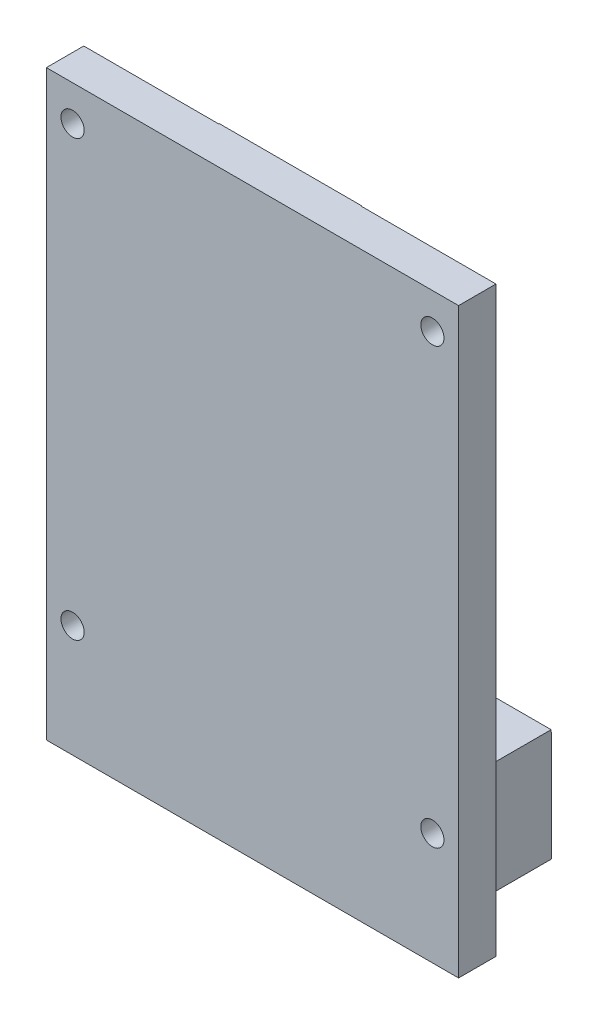
ISO-10303-21;
HEADER;
FILE_DESCRIPTION(('STEP AP214'),'2;1');
FILE_NAME('part.step','',(''),(''),'','','');
FILE_SCHEMA(('AUTOMOTIVE_DESIGN { 1 0 10303 214 1 1 1 1 }'));
ENDSEC;
DATA;
#1=APPLICATION_CONTEXT('core data for automotive mechanical design processes');
#2=APPLICATION_PROTOCOL_DEFINITION('international standard','automotive_design',2000,#1);
#3=PRODUCT_CONTEXT('',#1,'mechanical');
#4=PRODUCT('Part','Part','',(#3));
#5=PRODUCT_RELATED_PRODUCT_CATEGORY('part','',(#4));
#6=PRODUCT_DEFINITION_FORMATION('','',#4);
#7=PRODUCT_DEFINITION_CONTEXT('part definition',#1,'design');
#8=PRODUCT_DEFINITION('design','',#6,#7);
#9=PRODUCT_DEFINITION_SHAPE('','',#8);
#10=(LENGTH_UNIT() NAMED_UNIT(*) SI_UNIT(.MILLI.,.METRE.));
#11=(NAMED_UNIT(*) PLANE_ANGLE_UNIT() SI_UNIT($,.RADIAN.));
#12=(NAMED_UNIT(*) SI_UNIT($,.STERADIAN.) SOLID_ANGLE_UNIT());
#13=UNCERTAINTY_MEASURE_WITH_UNIT(LENGTH_MEASURE(1.E-05),#10,'distance_accuracy_value','');
#14=(GEOMETRIC_REPRESENTATION_CONTEXT(3) GLOBAL_UNCERTAINTY_ASSIGNED_CONTEXT((#13)) GLOBAL_UNIT_ASSIGNED_CONTEXT((#10,
#11,#12)) REPRESENTATION_CONTEXT('',''));
#15=CARTESIAN_POINT('',(0.,0.,0.));
#16=DIRECTION('',(0.,0.,1.));
#17=DIRECTION('',(1.,0.,0.));
#18=AXIS2_PLACEMENT_3D('',#15,#16,#17);
#19=CARTESIAN_POINT('',(0.,0.,0.));
#20=DIRECTION('',(0.,0.,1.));
#21=DIRECTION('',(1.,0.,0.));
#22=AXIS2_PLACEMENT_3D('',#19,#20,#21);
#23=PLANE('',#22);
#24=CARTESIAN_POINT('',(-24.05,23.1,0.));
#25=DIRECTION('',(0.,0.,1.));
#26=DIRECTION('',(1.,0.,0.));
#27=AXIS2_PLACEMENT_3D('',#24,#25,#26);
#28=CIRCLE('',#27,1.55);
#29=CARTESIAN_POINT('',(-22.5,23.1,0.));
#30=VERTEX_POINT('',#29);
#31=EDGE_CURVE('E229',#30,#30,#28,.T.);
#32=ORIENTED_EDGE('',*,*,#31,.T.);
#33=EDGE_LOOP('',(#32));
#34=FACE_BOUND('',#33,.T.);
#35=CARTESIAN_POINT('',(-24.05,-35.,0.));
#36=DIRECTION('',(0.,0.,1.));
#37=DIRECTION('',(1.,0.,0.));
#38=AXIS2_PLACEMENT_3D('',#35,#36,#37);
#39=CIRCLE('',#38,1.55);
#40=CARTESIAN_POINT('',(-22.5,-35.,0.));
#41=VERTEX_POINT('',#40);
#42=EDGE_CURVE('E226',#41,#41,#39,.T.);
#43=ORIENTED_EDGE('',*,*,#42,.T.);
#44=EDGE_LOOP('',(#43));
#45=FACE_BOUND('',#44,.T.);
#46=DIRECTION('',(1.,0.,0.));
#47=VECTOR('',#46,1.);
#48=CARTESIAN_POINT('',(-32.5,-50.,0.));
#49=LINE('',#48,#47);
#50=CARTESIAN_POINT('',(-27.55,-50.,0.));
#51=VERTEX_POINT('',#50);
#52=CARTESIAN_POINT('',(-19.99,-50.,0.));
#53=VERTEX_POINT('',#52);
#54=EDGE_CURVE('E164',#51,#53,#49,.T.);
#55=ORIENTED_EDGE('',*,*,#54,.F.);
#56=DIRECTION('',(0.,-1.,0.));
#57=VECTOR('',#56,1.);
#58=CARTESIAN_POINT('',(-27.55,31.5345007842526,0.));
#59=LINE('',#58,#57);
#60=CARTESIAN_POINT('',(-27.55,27.8391998848108,0.));
#61=VERTEX_POINT('',#60);
#62=EDGE_CURVE('E152',#61,#51,#59,.T.);
#63=ORIENTED_EDGE('',*,*,#62,.F.);
#64=DIRECTION('',(1.,0.,0.));
#65=VECTOR('',#64,1.);
#66=CARTESIAN_POINT('',(0.,27.8391998848108,0.));
#67=LINE('',#66,#65);
#68=CARTESIAN_POINT('',(-9.50000000000001,27.8391998848108,0.));
#69=VERTEX_POINT('',#68);
#70=EDGE_CURVE('E161',#61,#69,#67,.T.);
#71=ORIENTED_EDGE('',*,*,#70,.T.);
#72=DIRECTION('',(0.,-1.,0.));
#73=VECTOR('',#72,1.);
#74=CARTESIAN_POINT('',(-9.50000000000001,-35.,0.));
#75=LINE('',#74,#73);
#76=CARTESIAN_POINT('',(-9.50000000000004,-35.,0.));
#77=VERTEX_POINT('',#76);
#78=EDGE_CURVE('E201',#69,#77,#75,.T.);
#79=ORIENTED_EDGE('',*,*,#78,.T.);
#80=DIRECTION('',(1.,0.,0.));
#81=VECTOR('',#80,1.);
#82=CARTESIAN_POINT('',(32.5,-35.,0.));
#83=LINE('',#82,#81);
#84=CARTESIAN_POINT('',(-19.99,-35.,0.));
#85=VERTEX_POINT('',#84);
#86=EDGE_CURVE('E252',#85,#77,#83,.T.);
#87=ORIENTED_EDGE('',*,*,#86,.F.);
#88=DIRECTION('',(0.,1.,0.));
#89=VECTOR('',#88,1.);
#90=CARTESIAN_POINT('',(-19.99,-50.,0.));
#91=LINE('',#90,#89);
#92=EDGE_CURVE('E171',#53,#85,#91,.T.);
#93=ORIENTED_EDGE('',*,*,#92,.F.);
#94=EDGE_LOOP('',(#55,#63,#71,#79,#87,#93));
#95=FACE_BOUND('',#94,.T.);
#96=ADVANCED_FACE('F49',(#34,#45,#95),#23,.F.);
#97=CARTESIAN_POINT('',(32.5,-35.,-15.));
#98=DIRECTION('',(0.,-1.,0.));
#99=DIRECTION('',(0.,0.,-1.));
#100=AXIS2_PLACEMENT_3D('',#97,#98,#99);
#101=PLANE('',#100);
#102=CARTESIAN_POINT('',(14.99,-35.,-10.));
#103=DIRECTION('',(0.,1.,0.));
#104=DIRECTION('',(0.,0.,1.));
#105=AXIS2_PLACEMENT_3D('',#102,#103,#104);
#106=CIRCLE('',#105,1.675);
#107=CARTESIAN_POINT('',(14.99,-35.,-8.325));
#108=VERTEX_POINT('',#107);
#109=EDGE_CURVE('E243',#108,#108,#106,.T.);
#110=ORIENTED_EDGE('',*,*,#109,.F.);
#111=EDGE_LOOP('',(#110));
#112=FACE_BOUND('',#111,.T.);
#113=DIRECTION('',(0.,0.,1.));
#114=VECTOR('',#113,1.);
#115=CARTESIAN_POINT('',(19.99,-35.,0.));
#116=LINE('',#115,#114);
#117=CARTESIAN_POINT('',(19.99,-35.,-14.9311663726117));
#118=VERTEX_POINT('',#117);
#119=CARTESIAN_POINT('',(19.99,-35.,0.));
#120=VERTEX_POINT('',#119);
#121=EDGE_CURVE('E184',#118,#120,#116,.T.);
#122=ORIENTED_EDGE('',*,*,#121,.F.);
#123=DIRECTION('',(1.,0.,0.));
#124=VECTOR('',#123,1.);
#125=CARTESIAN_POINT('',(19.99,-35.,-14.9311663726117));
#126=LINE('',#125,#124);
#127=CARTESIAN_POINT('',(9.5,-35.,-14.9311663726117));
#128=VERTEX_POINT('',#127);
#129=EDGE_CURVE('E279',#118,#128,#126,.F.);
#130=ORIENTED_EDGE('',*,*,#129,.T.);
#131=DIRECTION('',(0.,0.,-1.));
#132=VECTOR('',#131,1.);
#133=CARTESIAN_POINT('',(9.5,-35.,-15.));
#134=LINE('',#133,#132);
#135=CARTESIAN_POINT('',(9.5,-35.,0.));
#136=VERTEX_POINT('',#135);
#137=EDGE_CURVE('E198',#136,#128,#134,.T.);
#138=ORIENTED_EDGE('',*,*,#137,.F.);
#139=EDGE_CURVE('E239',#136,#120,#83,.T.);
#140=ORIENTED_EDGE('',*,*,#139,.T.);
#141=EDGE_LOOP('',(#122,#130,#138,#140));
#142=FACE_BOUND('',#141,.T.);
#143=ADVANCED_FACE('F353',(#112,#142),#101,.F.);
#144=CARTESIAN_POINT('',(9.49999999999999,27.8391998848108,0.));
#145=VERTEX_POINT('',#144);
#146=CARTESIAN_POINT('',(27.55,27.8391998848108,0.));
#147=VERTEX_POINT('',#146);
#148=EDGE_CURVE('E172',#145,#147,#67,.T.);
#149=ORIENTED_EDGE('',*,*,#148,.T.);
#150=DIRECTION('',(0.,1.,0.));
#151=VECTOR('',#150,1.);
#152=CARTESIAN_POINT('',(27.55,32.7963880239999,0.));
#153=LINE('',#152,#151);
#154=CARTESIAN_POINT('',(27.55,-50.,0.));
#155=VERTEX_POINT('',#154);
#156=EDGE_CURVE('E68',#155,#147,#153,.T.);
#157=ORIENTED_EDGE('',*,*,#156,.F.);
#158=DIRECTION('',(1.,0.,0.));
#159=VECTOR('',#158,1.);
#160=CARTESIAN_POINT('',(32.5,-50.,0.));
#161=LINE('',#160,#159);
#162=CARTESIAN_POINT('',(19.99,-50.,0.));
#163=VERTEX_POINT('',#162);
#164=EDGE_CURVE('E183',#163,#155,#161,.T.);
#165=ORIENTED_EDGE('',*,*,#164,.F.);
#166=DIRECTION('',(0.,1.,0.));
#167=VECTOR('',#166,1.);
#168=CARTESIAN_POINT('',(19.99,-50.,0.));
#169=LINE('',#168,#167);
#170=EDGE_CURVE('E187',#163,#120,#169,.T.);
#171=ORIENTED_EDGE('',*,*,#170,.T.);
#172=ORIENTED_EDGE('',*,*,#139,.F.);
#173=DIRECTION('',(0.,-1.,0.));
#174=VECTOR('',#173,1.);
#175=CARTESIAN_POINT('',(9.5,-35.,0.));
#176=LINE('',#175,#174);
#177=EDGE_CURVE('E202',#145,#136,#176,.T.);
#178=ORIENTED_EDGE('',*,*,#177,.F.);
#179=EDGE_LOOP('',(#149,#157,#165,#171,#172,#178));
#180=FACE_BOUND('',#179,.T.);
#181=CARTESIAN_POINT('',(24.05,-35.,0.));
#182=DIRECTION('',(0.,0.,1.));
#183=DIRECTION('',(1.,0.,0.));
#184=AXIS2_PLACEMENT_3D('',#181,#182,#183);
#185=CIRCLE('',#184,1.55);
#186=CARTESIAN_POINT('',(25.6,-35.,0.));
#187=VERTEX_POINT('',#186);
#188=EDGE_CURVE('E223',#187,#187,#185,.T.);
#189=ORIENTED_EDGE('',*,*,#188,.T.);
#190=EDGE_LOOP('',(#189));
#191=FACE_BOUND('',#190,.T.);
#192=CARTESIAN_POINT('',(24.05,23.1,0.));
#193=DIRECTION('',(0.,0.,1.));
#194=DIRECTION('',(1.,0.,0.));
#195=AXIS2_PLACEMENT_3D('',#192,#193,#194);
#196=CIRCLE('',#195,1.55);
#197=CARTESIAN_POINT('',(25.6,23.1,0.));
#198=VERTEX_POINT('',#197);
#199=EDGE_CURVE('E232',#198,#198,#196,.T.);
#200=ORIENTED_EDGE('',*,*,#199,.T.);
#201=EDGE_LOOP('',(#200));
#202=FACE_BOUND('',#201,.T.);
#203=ADVANCED_FACE('F358',(#180,#191,#202),#23,.F.);
#204=CARTESIAN_POINT('',(-32.5,-50.,5.));
#205=DIRECTION('',(0.,1.,0.));
#206=DIRECTION('',(0.,0.,1.));
#207=AXIS2_PLACEMENT_3D('',#204,#205,#206);
#208=PLANE('',#207);
#209=CARTESIAN_POINT('',(-14.99,-50.,-10.));
#210=DIRECTION('',(0.,1.,0.));
#211=DIRECTION('',(0.,0.,1.));
#212=AXIS2_PLACEMENT_3D('',#209,#210,#211);
#213=CIRCLE('',#212,1.675);
#214=CARTESIAN_POINT('',(-14.99,-50.,-8.325));
#215=VERTEX_POINT('',#214);
#216=EDGE_CURVE('E236',#215,#215,#213,.T.);
#217=ORIENTED_EDGE('',*,*,#216,.T.);
#218=EDGE_LOOP('',(#217));
#219=FACE_BOUND('',#218,.T.);
#220=CARTESIAN_POINT('',(14.99,-50.,-10.));
#221=DIRECTION('',(0.,1.,0.));
#222=DIRECTION('',(0.,0.,1.));
#223=AXIS2_PLACEMENT_3D('',#220,#221,#222);
#224=CIRCLE('',#223,1.675);
#225=CARTESIAN_POINT('',(14.99,-50.,-8.325));
#226=VERTEX_POINT('',#225);
#227=EDGE_CURVE('E235',#226,#226,#224,.T.);
#228=ORIENTED_EDGE('',*,*,#227,.T.);
#229=EDGE_LOOP('',(#228));
#230=FACE_BOUND('',#229,.T.);
#231=ORIENTED_EDGE('',*,*,#164,.T.);
#232=DIRECTION('',(0.,0.,1.));
#233=VECTOR('',#232,1.);
#234=CARTESIAN_POINT('',(27.55,-50.,5.));
#235=LINE('',#234,#233);
#236=CARTESIAN_POINT('',(27.55,-50.,5.));
#237=VERTEX_POINT('',#236);
#238=EDGE_CURVE('E416',#155,#237,#235,.T.);
#239=ORIENTED_EDGE('',*,*,#238,.T.);
#240=DIRECTION('',(1.,0.,0.));
#241=VECTOR('',#240,1.);
#242=CARTESIAN_POINT('',(-32.5,-50.,5.));
#243=LINE('',#242,#241);
#244=CARTESIAN_POINT('',(-27.55,-50.,5.));
#245=VERTEX_POINT('',#244);
#246=EDGE_CURVE('E251',#245,#237,#243,.T.);
#247=ORIENTED_EDGE('',*,*,#246,.F.);
#248=DIRECTION('',(0.,0.,-1.));
#249=VECTOR('',#248,1.);
#250=CARTESIAN_POINT('',(-27.55,-50.,5.));
#251=LINE('',#250,#249);
#252=EDGE_CURVE('E420',#245,#51,#251,.T.);
#253=ORIENTED_EDGE('',*,*,#252,.T.);
#254=ORIENTED_EDGE('',*,*,#54,.T.);
#255=DIRECTION('',(0.,0.,-1.));
#256=VECTOR('',#255,1.);
#257=CARTESIAN_POINT('',(-19.99,-50.,0.));
#258=LINE('',#257,#256);
#259=CARTESIAN_POINT('',(-19.99,-50.,-15.));
#260=VERTEX_POINT('',#259);
#261=EDGE_CURVE('E174',#53,#260,#258,.T.);
#262=ORIENTED_EDGE('',*,*,#261,.T.);
#263=DIRECTION('',(-1.,0.,0.));
#264=VECTOR('',#263,1.);
#265=CARTESIAN_POINT('',(32.5,-50.,-15.));
#266=LINE('',#265,#264);
#267=CARTESIAN_POINT('',(19.99,-50.,-15.));
#268=VERTEX_POINT('',#267);
#269=EDGE_CURVE('E248',#268,#260,#266,.T.);
#270=ORIENTED_EDGE('',*,*,#269,.F.);
#271=DIRECTION('',(0.,0.,1.));
#272=VECTOR('',#271,1.);
#273=CARTESIAN_POINT('',(19.99,-50.,0.));
#274=LINE('',#273,#272);
#275=EDGE_CURVE('E180',#268,#163,#274,.T.);
#276=ORIENTED_EDGE('',*,*,#275,.T.);
#277=EDGE_LOOP('',(#231,#239,#247,#253,#254,#262,#270,#276));
#278=FACE_BOUND('',#277,.T.);
#279=ADVANCED_FACE('F356',(#219,#230,#278),#208,.F.);
#280=CARTESIAN_POINT('',(0.,0.,5.));
#281=DIRECTION('',(0.,0.,1.));
#282=DIRECTION('',(1.,0.,0.));
#283=AXIS2_PLACEMENT_3D('',#280,#281,#282);
#284=PLANE('',#283);
#285=DIRECTION('',(0.,-1.,0.));
#286=VECTOR('',#285,1.);
#287=CARTESIAN_POINT('',(27.55,0.,5.));
#288=LINE('',#287,#286);
#289=CARTESIAN_POINT('',(27.55,27.8391998848108,5.));
#290=VERTEX_POINT('',#289);
#291=EDGE_CURVE('E424',#290,#237,#288,.T.);
#292=ORIENTED_EDGE('',*,*,#291,.F.);
#293=DIRECTION('',(1.,0.,0.));
#294=VECTOR('',#293,1.);
#295=CARTESIAN_POINT('',(-32.5,27.8391998848108,5.));
#296=LINE('',#295,#294);
#297=CARTESIAN_POINT('',(-27.55,27.8391998848108,5.));
#298=VERTEX_POINT('',#297);
#299=EDGE_CURVE('E427',#298,#290,#296,.T.);
#300=ORIENTED_EDGE('',*,*,#299,.F.);
#301=DIRECTION('',(0.,1.,0.));
#302=VECTOR('',#301,1.);
#303=CARTESIAN_POINT('',(-27.55,0.,5.));
#304=LINE('',#303,#302);
#305=EDGE_CURVE('E75',#245,#298,#304,.T.);
#306=ORIENTED_EDGE('',*,*,#305,.F.);
#307=ORIENTED_EDGE('',*,*,#246,.T.);
#308=EDGE_LOOP('',(#292,#300,#306,#307));
#309=FACE_BOUND('',#308,.T.);
#310=CARTESIAN_POINT('',(24.05,23.1,5.));
#311=DIRECTION('',(0.,0.,1.));
#312=DIRECTION('',(1.,0.,0.));
#313=AXIS2_PLACEMENT_3D('',#310,#311,#312);
#314=CIRCLE('',#313,1.55);
#315=CARTESIAN_POINT('',(25.6,23.1,5.));
#316=VERTEX_POINT('',#315);
#317=EDGE_CURVE('E215',#316,#316,#314,.T.);
#318=ORIENTED_EDGE('',*,*,#317,.F.);
#319=EDGE_LOOP('',(#318));
#320=FACE_BOUND('',#319,.T.);
#321=CARTESIAN_POINT('',(-24.05,-35.,5.));
#322=DIRECTION('',(0.,0.,1.));
#323=DIRECTION('',(1.,0.,0.));
#324=AXIS2_PLACEMENT_3D('',#321,#322,#323);
#325=CIRCLE('',#324,1.55);
#326=CARTESIAN_POINT('',(-22.5,-35.,5.));
#327=VERTEX_POINT('',#326);
#328=EDGE_CURVE('E214',#327,#327,#325,.T.);
#329=ORIENTED_EDGE('',*,*,#328,.F.);
#330=EDGE_LOOP('',(#329));
#331=FACE_BOUND('',#330,.T.);
#332=CARTESIAN_POINT('',(24.05,-35.,5.));
#333=DIRECTION('',(0.,0.,1.));
#334=DIRECTION('',(1.,0.,0.));
#335=AXIS2_PLACEMENT_3D('',#332,#333,#334);
#336=CIRCLE('',#335,1.55);
#337=CARTESIAN_POINT('',(25.6,-35.,5.));
#338=VERTEX_POINT('',#337);
#339=EDGE_CURVE('E209',#338,#338,#336,.T.);
#340=ORIENTED_EDGE('',*,*,#339,.F.);
#341=EDGE_LOOP('',(#340));
#342=FACE_BOUND('',#341,.T.);
#343=CARTESIAN_POINT('',(-24.05,23.1,5.));
#344=DIRECTION('',(0.,0.,1.));
#345=DIRECTION('',(1.,0.,0.));
#346=AXIS2_PLACEMENT_3D('',#343,#344,#345);
#347=CIRCLE('',#346,1.55);
#348=CARTESIAN_POINT('',(-22.5,23.1,5.));
#349=VERTEX_POINT('',#348);
#350=EDGE_CURVE('E218',#349,#349,#347,.T.);
#351=ORIENTED_EDGE('',*,*,#350,.F.);
#352=EDGE_LOOP('',(#351));
#353=FACE_BOUND('',#352,.T.);
#354=ADVANCED_FACE('F351',(#309,#320,#331,#342,#353),#284,.T.);
#355=CARTESIAN_POINT('',(-14.99,-35.,-10.));
#356=DIRECTION('',(0.,1.,0.));
#357=DIRECTION('',(0.,0.,1.));
#358=AXIS2_PLACEMENT_3D('',#355,#356,#357);
#359=CIRCLE('',#358,1.675);
#360=CARTESIAN_POINT('',(-14.99,-35.,-8.325));
#361=VERTEX_POINT('',#360);
#362=EDGE_CURVE('E240',#361,#361,#359,.T.);
#363=ORIENTED_EDGE('',*,*,#362,.F.);
#364=EDGE_LOOP('',(#363));
#365=FACE_BOUND('',#364,.T.);
#366=DIRECTION('',(0.,0.,-1.));
#367=VECTOR('',#366,1.);
#368=CARTESIAN_POINT('',(-9.50000000000001,-35.,-15.));
#369=LINE('',#368,#367);
#370=CARTESIAN_POINT('',(-9.50000000000001,-35.,-14.9311663726117));
#371=VERTEX_POINT('',#370);
#372=EDGE_CURVE('E206',#77,#371,#369,.T.);
#373=ORIENTED_EDGE('',*,*,#372,.T.);
#374=DIRECTION('',(1.,0.,0.));
#375=VECTOR('',#374,1.);
#376=CARTESIAN_POINT('',(-9.50000000000001,-35.,-14.9311663726117));
#377=LINE('',#376,#375);
#378=CARTESIAN_POINT('',(-19.99,-35.,-14.9311663726117));
#379=VERTEX_POINT('',#378);
#380=EDGE_CURVE('E303',#371,#379,#377,.F.);
#381=ORIENTED_EDGE('',*,*,#380,.T.);
#382=DIRECTION('',(0.,0.,-1.));
#383=VECTOR('',#382,1.);
#384=CARTESIAN_POINT('',(-19.99,-35.,0.));
#385=LINE('',#384,#383);
#386=EDGE_CURVE('E189',#85,#379,#385,.T.);
#387=ORIENTED_EDGE('',*,*,#386,.F.);
#388=ORIENTED_EDGE('',*,*,#86,.T.);
#389=EDGE_LOOP('',(#373,#381,#387,#388));
#390=FACE_BOUND('',#389,.T.);
#391=ADVANCED_FACE('F347',(#365,#390),#101,.F.);
#392=CARTESIAN_POINT('',(0.,0.,-15.));
#393=DIRECTION('',(0.,0.,-1.));
#394=DIRECTION('',(-1.,0.,0.));
#395=AXIS2_PLACEMENT_3D('',#392,#393,#394);
#396=PLANE('',#395);
#397=DIRECTION('',(0.,-1.,0.));
#398=VECTOR('',#397,1.);
#399=CARTESIAN_POINT('',(-19.99,0.,-15.));
#400=LINE('',#399,#398);
#401=CARTESIAN_POINT('',(-19.99,-36.1712960682537,-15.));
#402=VERTEX_POINT('',#401);
#403=EDGE_CURVE('E257',#402,#260,#400,.T.);
#404=ORIENTED_EDGE('',*,*,#403,.F.);
#405=CARTESIAN_POINT('',(-99.95,-36.1712960682537,-15.));
#406=CARTESIAN_POINT('',(-69.8,-36.1712960682537,-15.));
#407=CARTESIAN_POINT('',(-39.65,-36.1712960682537,-15.));
#408=CARTESIAN_POINT('',(-9.50000000000006,-36.1712960682537,-15.));
#409=CARTESIAN_POINT('',(-3.16666666666672,-36.1712960682537,-15.));
#410=CARTESIAN_POINT('',(3.16666666666661,-36.1712960682537,-15.));
#411=CARTESIAN_POINT('',(9.49999999999994,-36.1712960682537,-15.));
#412=CARTESIAN_POINT('',(39.6499999999999,-36.1712960682537,-15.));
#413=CARTESIAN_POINT('',(69.7999999999999,-36.1712960682537,-15.));
#414=CARTESIAN_POINT('',(99.9499999999999,-36.1712960682537,-15.));
#415=(BOUNDED_CURVE() B_SPLINE_CURVE(3,(#405,#406,#407,#408,#409,#410,#411,#412,#413,#414),
.UNSPECIFIED.,.F.,.F.) B_SPLINE_CURVE_WITH_KNOTS((4,3,3,4),(-0.0255398949289695,
0.0649101050710304,0.0839101050710304,0.17436010507103),
.UNSPECIFIED.) CURVE() GEOMETRIC_REPRESENTATION_ITEM() RATIONAL_B_SPLINE_CURVE((1.,1.,1.,1.,1.,
1.,1.,1.,1.,1.)) REPRESENTATION_ITEM(''));
#416=CARTESIAN_POINT('',(19.99,-36.1712960682537,-15.));
#417=VERTEX_POINT('',#416);
#418=EDGE_CURVE('E264',#402,#417,#415,.T.);
#419=ORIENTED_EDGE('',*,*,#418,.T.);
#420=DIRECTION('',(0.,1.,0.));
#421=VECTOR('',#420,1.);
#422=CARTESIAN_POINT('',(19.99,0.,-15.));
#423=LINE('',#422,#421);
#424=EDGE_CURVE('E259',#268,#417,#423,.T.);
#425=ORIENTED_EDGE('',*,*,#424,.F.);
#426=ORIENTED_EDGE('',*,*,#269,.T.);
#427=EDGE_LOOP('',(#404,#419,#425,#426));
#428=FACE_BOUND('',#427,.T.);
#429=ADVANCED_FACE('F343',(#428),#396,.T.);
#430=CARTESIAN_POINT('',(14.99,-50.,-10.));
#431=DIRECTION('',(0.,1.,0.));
#432=DIRECTION('',(0.,0.,1.));
#433=AXIS2_PLACEMENT_3D('',#430,#431,#432);
#434=CYLINDRICAL_SURFACE('',#433,1.675);
#435=ORIENTED_EDGE('',*,*,#227,.F.);
#436=EDGE_LOOP('',(#435));
#437=FACE_BOUND('',#436,.T.);
#438=ORIENTED_EDGE('',*,*,#109,.T.);
#439=EDGE_LOOP('',(#438));
#440=FACE_BOUND('',#439,.T.);
#441=ADVANCED_FACE('F339',(#437,#440),#434,.F.);
#442=CARTESIAN_POINT('',(-14.99,-50.,-10.));
#443=DIRECTION('',(0.,1.,0.));
#444=DIRECTION('',(0.,0.,1.));
#445=AXIS2_PLACEMENT_3D('',#442,#443,#444);
#446=CYLINDRICAL_SURFACE('',#445,1.675);
#447=ORIENTED_EDGE('',*,*,#216,.F.);
#448=EDGE_LOOP('',(#447));
#449=FACE_BOUND('',#448,.T.);
#450=ORIENTED_EDGE('',*,*,#362,.T.);
#451=EDGE_LOOP('',(#450));
#452=FACE_BOUND('',#451,.T.);
#453=ADVANCED_FACE('F325',(#449,#452),#446,.F.);
#454=CARTESIAN_POINT('',(24.05,-35.,-10.));
#455=DIRECTION('',(0.,0.,1.));
#456=DIRECTION('',(1.,0.,0.));
#457=AXIS2_PLACEMENT_3D('',#454,#455,#456);
#458=CYLINDRICAL_SURFACE('',#457,1.55);
#459=ORIENTED_EDGE('',*,*,#339,.T.);
#460=EDGE_LOOP('',(#459));
#461=FACE_BOUND('',#460,.T.);
#462=ORIENTED_EDGE('',*,*,#188,.F.);
#463=EDGE_LOOP('',(#462));
#464=FACE_BOUND('',#463,.T.);
#465=ADVANCED_FACE('F321',(#461,#464),#458,.F.);
#466=CARTESIAN_POINT('',(-24.05,-35.,-10.));
#467=DIRECTION('',(0.,0.,1.));
#468=DIRECTION('',(1.,0.,0.));
#469=AXIS2_PLACEMENT_3D('',#466,#467,#468);
#470=CYLINDRICAL_SURFACE('',#469,1.55);
#471=ORIENTED_EDGE('',*,*,#328,.T.);
#472=EDGE_LOOP('',(#471));
#473=FACE_BOUND('',#472,.T.);
#474=ORIENTED_EDGE('',*,*,#42,.F.);
#475=EDGE_LOOP('',(#474));
#476=FACE_BOUND('',#475,.T.);
#477=ADVANCED_FACE('F324',(#473,#476),#470,.F.);
#478=CARTESIAN_POINT('',(-24.05,23.1,-10.));
#479=DIRECTION('',(0.,0.,1.));
#480=DIRECTION('',(1.,0.,0.));
#481=AXIS2_PLACEMENT_3D('',#478,#479,#480);
#482=CYLINDRICAL_SURFACE('',#481,1.55);
#483=ORIENTED_EDGE('',*,*,#350,.T.);
#484=EDGE_LOOP('',(#483));
#485=FACE_BOUND('',#484,.T.);
#486=ORIENTED_EDGE('',*,*,#31,.F.);
#487=EDGE_LOOP('',(#486));
#488=FACE_BOUND('',#487,.T.);
#489=ADVANCED_FACE('F329',(#485,#488),#482,.F.);
#490=CARTESIAN_POINT('',(24.05,23.1,-10.));
#491=DIRECTION('',(0.,0.,1.));
#492=DIRECTION('',(1.,0.,0.));
#493=AXIS2_PLACEMENT_3D('',#490,#491,#492);
#494=CYLINDRICAL_SURFACE('',#493,1.55);
#495=ORIENTED_EDGE('',*,*,#317,.T.);
#496=EDGE_LOOP('',(#495));
#497=FACE_BOUND('',#496,.T.);
#498=ORIENTED_EDGE('',*,*,#199,.F.);
#499=EDGE_LOOP('',(#498));
#500=FACE_BOUND('',#499,.T.);
#501=ADVANCED_FACE('F319',(#497,#500),#494,.F.);
#502=CARTESIAN_POINT('',(-9.50000000000001,0.,0.));
#503=DIRECTION('',(-1.,0.,0.));
#504=DIRECTION('',(0.,-1.,0.));
#505=AXIS2_PLACEMENT_3D('',#502,#503,#504);
#506=PLANE('',#505);
#507=DIRECTION('',(0.,0.972932656626301,0.231088826363563));
#508=VECTOR('',#507,1.);
#509=CARTESIAN_POINT('',(-9.50000000000001,28.1531609686499,0.));
#510=LINE('',#509,#508);
#511=CARTESIAN_POINT('',(-9.5,-33.8604078046181,-14.729326566263));
#512=VERTEX_POINT('',#511);
#513=CARTESIAN_POINT('',(-9.50000000000004,27.8391998848108,-0.0745713466333703));
#514=VERTEX_POINT('',#513);
#515=EDGE_CURVE('E207',#512,#514,#510,.T.);
#516=ORIENTED_EDGE('',*,*,#515,.F.);
#517=CARTESIAN_POINT('',(-9.50000000000006,-33.8604078046181,-14.729326566263));
#518=CARTESIAN_POINT('',(-9.50000000000001,-34.0483915798912,-14.7739664395218));
#519=CARTESIAN_POINT('',(-9.49999999999999,-34.2373494838096,-14.8131063600136));
#520=CARTESIAN_POINT('',(-9.50000000000001,-34.617213548937,-14.8803862954632));
#521=CARTESIAN_POINT('',(-9.50000000000005,-34.8081197101459,-14.9085263104209));
#522=CARTESIAN_POINT('',(-9.50000000000011,-35.,-14.9311663726117));
#523=B_SPLINE_CURVE_WITH_KNOTS('',3,(#517,#518,#519,#520,#521,#522),.UNSPECIFIED.,.F.,.F.,(4,2,
4),(0.,0.578906905697366,1.15781381139472),.UNSPECIFIED.);
#524=EDGE_CURVE('E305',#512,#371,#523,.T.);
#525=ORIENTED_EDGE('',*,*,#524,.T.);
#526=ORIENTED_EDGE('',*,*,#372,.F.);
#527=ORIENTED_EDGE('',*,*,#78,.F.);
#528=DIRECTION('',(0.,0.,1.));
#529=VECTOR('',#528,1.);
#530=CARTESIAN_POINT('',(-9.50000000000001,27.8391998848108,0.));
#531=LINE('',#530,#529);
#532=EDGE_CURVE('E169',#514,#69,#531,.T.);
#533=ORIENTED_EDGE('',*,*,#532,.F.);
#534=EDGE_LOOP('',(#516,#525,#526,#527,#533));
#535=FACE_BOUND('',#534,.T.);
#536=ADVANCED_FACE('F315',(#535),#506,.T.);
#537=CARTESIAN_POINT('',(9.49999999999999,0.,0.));
#538=DIRECTION('',(-1.,0.,0.));
#539=DIRECTION('',(0.,-1.,0.));
#540=AXIS2_PLACEMENT_3D('',#537,#538,#539);
#541=PLANE('',#540);
#542=ORIENTED_EDGE('',*,*,#137,.T.);
#543=CARTESIAN_POINT('',(9.5,-35.,-14.9311663726117));
#544=CARTESIAN_POINT('',(9.50000000000001,-34.8081197101459,-14.9085263104209));
#545=CARTESIAN_POINT('',(9.50000000000001,-34.617213548937,-14.8803862954632));
#546=CARTESIAN_POINT('',(9.49999999999999,-34.2373494838096,-14.8131063600136));
#547=CARTESIAN_POINT('',(9.49999999999997,-34.0483915798912,-14.7739664395218));
#548=CARTESIAN_POINT('',(9.49999999999994,-33.8604078046181,-14.729326566263));
#549=B_SPLINE_CURVE_WITH_KNOTS('',3,(#543,#544,#545,#546,#547,#548),.UNSPECIFIED.,.F.,.F.,(4,2,
4),(0.,0.578906905697363,1.15781381139473),.UNSPECIFIED.);
#550=CARTESIAN_POINT('',(9.5,-33.8604078046181,-14.729326566263));
#551=VERTEX_POINT('',#550);
#552=EDGE_CURVE('E392',#128,#551,#549,.T.);
#553=ORIENTED_EDGE('',*,*,#552,.T.);
#554=DIRECTION('',(0.,0.972932656626301,0.231088826363563));
#555=VECTOR('',#554,1.);
#556=CARTESIAN_POINT('',(9.49999999999999,28.1531609686499,0.));
#557=LINE('',#556,#555);
#558=CARTESIAN_POINT('',(9.49999999999999,27.8391998848108,-0.0745713466333706));
#559=VERTEX_POINT('',#558);
#560=EDGE_CURVE('E191',#551,#559,#557,.T.);
#561=ORIENTED_EDGE('',*,*,#560,.T.);
#562=DIRECTION('',(0.,0.,1.));
#563=VECTOR('',#562,1.);
#564=CARTESIAN_POINT('',(9.49999999999999,27.8391998848108,0.));
#565=LINE('',#564,#563);
#566=EDGE_CURVE('E428',#559,#145,#565,.T.);
#567=ORIENTED_EDGE('',*,*,#566,.T.);
#568=ORIENTED_EDGE('',*,*,#177,.T.);
#569=EDGE_LOOP('',(#542,#553,#561,#567,#568));
#570=FACE_BOUND('',#569,.T.);
#571=ADVANCED_FACE('F294',(#570),#541,.F.);
#572=CARTESIAN_POINT('',(-74.4101050710304,28.1531609686499,0.));
#573=DIRECTION('',(0.,0.231088826363563,-0.9729326566263));
#574=DIRECTION('',(0.,0.972932656626301,0.231088826363563));
#575=AXIS2_PLACEMENT_3D('',#572,#573,#574);
#576=PLANE('',#575);
#577=ORIENTED_EDGE('',*,*,#560,.F.);
#578=CARTESIAN_POINT('',(-99.95,-33.8604078046181,-14.729326566263));
#579=CARTESIAN_POINT('',(-69.8,-33.8604078046181,-14.729326566263));
#580=CARTESIAN_POINT('',(-39.65,-33.8604078046181,-14.729326566263));
#581=CARTESIAN_POINT('',(-9.50000000000006,-33.8604078046181,-14.729326566263));
#582=CARTESIAN_POINT('',(-3.16666666666672,-33.8604078046181,-14.729326566263));
#583=CARTESIAN_POINT('',(3.16666666666661,-33.8604078046181,-14.729326566263));
#584=CARTESIAN_POINT('',(9.49999999999994,-33.8604078046181,-14.729326566263));
#585=CARTESIAN_POINT('',(39.6499999999999,-33.8604078046181,-14.729326566263));
#586=CARTESIAN_POINT('',(69.7999999999999,-33.860407804618,-14.729326566263));
#587=CARTESIAN_POINT('',(99.9499999999999,-33.860407804618,-14.729326566263));
#588=(BOUNDED_CURVE() B_SPLINE_CURVE(3,(#578,#579,#580,#581,#582,#583,#584,#585,#586,#587),
.UNSPECIFIED.,.F.,.F.) B_SPLINE_CURVE_WITH_KNOTS((4,3,3,4),(-0.0255398949289695,
0.0649101050710304,0.0839101050710304,0.17436010507103),
.UNSPECIFIED.) CURVE() GEOMETRIC_REPRESENTATION_ITEM() RATIONAL_B_SPLINE_CURVE((1.,1.,1.,1.,1.,
1.,1.,1.,1.,1.)) REPRESENTATION_ITEM(''));
#589=EDGE_CURVE('E312',#551,#512,#588,.F.);
#590=ORIENTED_EDGE('',*,*,#589,.T.);
#591=ORIENTED_EDGE('',*,*,#515,.T.);
#592=DIRECTION('',(-1.,0.,0.));
#593=VECTOR('',#592,1.);
#594=CARTESIAN_POINT('',(-74.4101050710304,27.8391998848108,-0.0745713466333681));
#595=LINE('',#594,#593);
#596=EDGE_CURVE('E262',#559,#514,#595,.T.);
#597=ORIENTED_EDGE('',*,*,#596,.F.);
#598=EDGE_LOOP('',(#577,#590,#591,#597));
#599=FACE_BOUND('',#598,.T.);
#600=ADVANCED_FACE('F292',(#599),#576,.T.);
#601=CARTESIAN_POINT('',(-19.99,-50.,0.));
#602=DIRECTION('',(1.,0.,0.));
#603=DIRECTION('',(0.,0.,-1.));
#604=AXIS2_PLACEMENT_3D('',#601,#602,#603);
#605=PLANE('',#604);
#606=ORIENTED_EDGE('',*,*,#386,.T.);
#607=CARTESIAN_POINT('',(-19.99,-35.,-14.9311663726117));
#608=CARTESIAN_POINT('',(-19.99,-35.1942064686476,-14.9540614581544));
#609=CARTESIAN_POINT('',(-19.99,-35.3887488714529,-14.9712451109593));
#610=CARTESIAN_POINT('',(-19.99,-35.7791785698584,-14.9942291711205));
#611=CARTESIAN_POINT('',(-19.99,-35.9750681898042,-14.9999900607784));
#612=CARTESIAN_POINT('',(-19.99,-36.1712960682537,-15.));
#613=B_SPLINE_CURVE_WITH_KNOTS('',3,(#607,#608,#609,#610,#611,#612),.UNSPECIFIED.,.F.,.F.,(4,2,
4),(0.,0.585899496259349,1.17382243293538),.UNSPECIFIED.);
#614=EDGE_CURVE('E158',#379,#402,#613,.T.);
#615=ORIENTED_EDGE('',*,*,#614,.T.);
#616=ORIENTED_EDGE('',*,*,#403,.T.);
#617=ORIENTED_EDGE('',*,*,#261,.F.);
#618=ORIENTED_EDGE('',*,*,#92,.T.);
#619=EDGE_LOOP('',(#606,#615,#616,#617,#618));
#620=FACE_BOUND('',#619,.T.);
#621=ADVANCED_FACE('F286',(#620),#605,.F.);
#622=CARTESIAN_POINT('',(19.99,-50.,0.));
#623=DIRECTION('',(-1.,0.,0.));
#624=DIRECTION('',(0.,0.,1.));
#625=AXIS2_PLACEMENT_3D('',#622,#623,#624);
#626=PLANE('',#625);
#627=ORIENTED_EDGE('',*,*,#424,.T.);
#628=CARTESIAN_POINT('',(19.99,-36.1712960682537,-15.));
#629=CARTESIAN_POINT('',(19.99,-35.9757447008082,-14.9999901630483));
#630=CARTESIAN_POINT('',(19.99,-35.7805286894326,-14.9942688593864));
#631=CARTESIAN_POINT('',(19.99,-35.3900943463354,-14.9713638348571));
#632=CARTESIAN_POINT('',(19.99,-35.1948783349597,-14.9541405960563));
#633=CARTESIAN_POINT('',(19.99,-35.,-14.9311663726117));
#634=B_SPLINE_CURVE_WITH_KNOTS('',3,(#628,#629,#630,#631,#632,#633),.UNSPECIFIED.,.F.,.F.,(4,2,
4),(0.,0.585899496259367,1.17382243293538),.UNSPECIFIED.);
#635=EDGE_CURVE('E269',#417,#118,#634,.T.);
#636=ORIENTED_EDGE('',*,*,#635,.T.);
#637=ORIENTED_EDGE('',*,*,#121,.T.);
#638=ORIENTED_EDGE('',*,*,#170,.F.);
#639=ORIENTED_EDGE('',*,*,#275,.F.);
#640=EDGE_LOOP('',(#627,#636,#637,#638,#639));
#641=FACE_BOUND('',#640,.T.);
#642=ADVANCED_FACE('F281',(#641),#626,.F.);
#643=CARTESIAN_POINT('',(-32.5,27.8391998848108,-5.));
#644=DIRECTION('',(0.,-1.,0.));
#645=DIRECTION('',(0.,0.,-1.));
#646=AXIS2_PLACEMENT_3D('',#643,#644,#645);
#647=PLANE('',#646);
#648=ORIENTED_EDGE('',*,*,#299,.T.);
#649=DIRECTION('',(0.,0.,-1.));
#650=VECTOR('',#649,1.);
#651=CARTESIAN_POINT('',(27.55,27.8391998848108,-5.));
#652=LINE('',#651,#650);
#653=EDGE_CURVE('E12',#290,#147,#652,.T.);
#654=ORIENTED_EDGE('',*,*,#653,.T.);
#655=ORIENTED_EDGE('',*,*,#148,.F.);
#656=ORIENTED_EDGE('',*,*,#566,.F.);
#657=ORIENTED_EDGE('',*,*,#596,.T.);
#658=ORIENTED_EDGE('',*,*,#532,.T.);
#659=ORIENTED_EDGE('',*,*,#70,.F.);
#660=DIRECTION('',(0.,0.,1.));
#661=VECTOR('',#660,1.);
#662=CARTESIAN_POINT('',(-27.55,27.8391998848108,-5.));
#663=LINE('',#662,#661);
#664=EDGE_CURVE('E61',#61,#298,#663,.T.);
#665=ORIENTED_EDGE('',*,*,#664,.T.);
#666=EDGE_LOOP('',(#648,#654,#655,#656,#657,#658,#659,#665));
#667=FACE_BOUND('',#666,.T.);
#668=ADVANCED_FACE('F166',(#667),#647,.F.);
#669=CARTESIAN_POINT('',(-27.986,-36.1712960682537,-15.));
#670=CARTESIAN_POINT('',(-21.824,-36.1712960682537,-15.));
#671=CARTESIAN_POINT('',(-15.662,-36.1712960682537,-15.));
#672=CARTESIAN_POINT('',(-9.50000000000006,-36.1712960682537,-15.));
#673=CARTESIAN_POINT('',(-3.16666666666672,-36.1712960682537,-15.));
#674=CARTESIAN_POINT('',(3.16666666666661,-36.1712960682537,-15.));
#675=CARTESIAN_POINT('',(9.49999999999994,-36.1712960682537,-15.));
#676=CARTESIAN_POINT('',(15.662,-36.1712960682537,-15.));
#677=CARTESIAN_POINT('',(21.824,-36.1712960682537,-15.));
#678=CARTESIAN_POINT('',(27.986,-36.1712960682537,-15.));
#679=CARTESIAN_POINT('',(-27.986,-35.,-15.));
#680=CARTESIAN_POINT('',(-21.824,-35.,-15.));
#681=CARTESIAN_POINT('',(-15.662,-35.,-15.));
#682=CARTESIAN_POINT('',(-9.50000000000006,-35.,-15.));
#683=CARTESIAN_POINT('',(-3.16666666666672,-35.,-15.));
#684=CARTESIAN_POINT('',(3.16666666666661,-35.,-15.));
#685=CARTESIAN_POINT('',(9.49999999999994,-35.,-15.));
#686=CARTESIAN_POINT('',(15.662,-35.,-15.));
#687=CARTESIAN_POINT('',(21.824,-35.,-15.));
#688=CARTESIAN_POINT('',(27.986,-35.,-15.));
#689=CARTESIAN_POINT('',(-27.986,-33.8604078046181,-14.729326566263));
#690=CARTESIAN_POINT('',(-21.824,-33.8604078046181,-14.729326566263));
#691=CARTESIAN_POINT('',(-15.662,-33.8604078046181,-14.729326566263));
#692=CARTESIAN_POINT('',(-9.50000000000006,-33.8604078046181,-14.729326566263));
#693=CARTESIAN_POINT('',(-3.16666666666672,-33.8604078046181,-14.729326566263));
#694=CARTESIAN_POINT('',(3.16666666666661,-33.8604078046181,-14.729326566263));
#695=CARTESIAN_POINT('',(9.49999999999994,-33.8604078046181,-14.729326566263));
#696=CARTESIAN_POINT('',(15.662,-33.8604078046181,-14.729326566263));
#697=CARTESIAN_POINT('',(21.824,-33.8604078046181,-14.729326566263));
#698=CARTESIAN_POINT('',(27.986,-33.8604078046181,-14.729326566263));
#699=(BOUNDED_SURFACE() B_SPLINE_SURFACE(2,3,((#669,#670,#671,#672,#673,#674,#675,#676,#677,
#678),(#679,#680,#681,#682,#683,#684,#685,#686,#687,#688),(#689,#690,#691,#692,#693,#694,#695,
#696,#697,#698)),.UNSPECIFIED.,.F.,.F.,.F.) B_SPLINE_SURFACE_WITH_KNOTS((3,3),(4,3,3,4),(0.,1.),
(0.0464241050710305,0.0649101050710304,0.0839101050710304,0.10239610507103),
.UNSPECIFIED.) GEOMETRIC_REPRESENTATION_ITEM() RATIONAL_B_SPLINE_SURFACE(((1.,1.,1.,1.,1.,1.,1.,
1.,1.,1.),(0.993210112872976,0.993210112872976,0.993210112872976,0.993210112872976,
0.993210112872976,0.993210112872976,0.993210112872976,0.993210112872976,0.993210112872977,
0.993210112872977),(1.,1.,1.,1.,1.,1.,1.,1.,1.,1.))) REPRESENTATION_ITEM('') SURFACE());
#700=ORIENTED_EDGE('',*,*,#524,.F.);
#701=ORIENTED_EDGE('',*,*,#589,.F.);
#702=ORIENTED_EDGE('',*,*,#552,.F.);
#703=ORIENTED_EDGE('',*,*,#129,.F.);
#704=ORIENTED_EDGE('',*,*,#635,.F.);
#705=ORIENTED_EDGE('',*,*,#418,.F.);
#706=ORIENTED_EDGE('',*,*,#614,.F.);
#707=ORIENTED_EDGE('',*,*,#380,.F.);
#708=EDGE_LOOP('',(#700,#701,#702,#703,#704,#705,#706,#707));
#709=FACE_BOUND('',#708,.T.);
#710=ADVANCED_FACE('F52',(#709),#699,.T.);
#711=CARTESIAN_POINT('',(-27.55,31.5345007842526,10.));
#712=DIRECTION('',(1.,0.,0.));
#713=DIRECTION('',(0.,1.,0.));
#714=AXIS2_PLACEMENT_3D('',#711,#712,#713);
#715=PLANE('',#714);
#716=ORIENTED_EDGE('',*,*,#305,.T.);
#717=ORIENTED_EDGE('',*,*,#664,.F.);
#718=ORIENTED_EDGE('',*,*,#62,.T.);
#719=ORIENTED_EDGE('',*,*,#252,.F.);
#720=EDGE_LOOP('',(#716,#717,#718,#719));
#721=FACE_BOUND('',#720,.T.);
#722=ADVANCED_FACE('F151',(#721),#715,.F.);
#723=CARTESIAN_POINT('',(27.55,32.7963880239999,10.));
#724=DIRECTION('',(-1.,0.,0.));
#725=DIRECTION('',(0.,-1.,0.));
#726=AXIS2_PLACEMENT_3D('',#723,#724,#725);
#727=PLANE('',#726);
#728=ORIENTED_EDGE('',*,*,#156,.T.);
#729=ORIENTED_EDGE('',*,*,#653,.F.);
#730=ORIENTED_EDGE('',*,*,#291,.T.);
#731=ORIENTED_EDGE('',*,*,#238,.F.);
#732=EDGE_LOOP('',(#728,#729,#730,#731));
#733=FACE_BOUND('',#732,.T.);
#734=ADVANCED_FACE('F432',(#733),#727,.F.);
#735=CLOSED_SHELL('',(#96,#143,#203,#279,#354,#391,#429,#441,#453,#465,#477,#489,#501,#536,#571,
#600,#621,#642,#668,#710,#722,#734));
#736=MANIFOLD_SOLID_BREP('B2',#735);
#737=ADVANCED_BREP_SHAPE_REPRESENTATION('',(#18,#736),#14);
#738=SHAPE_DEFINITION_REPRESENTATION(#9,#737);
ENDSEC;
END-ISO-10303-21;
